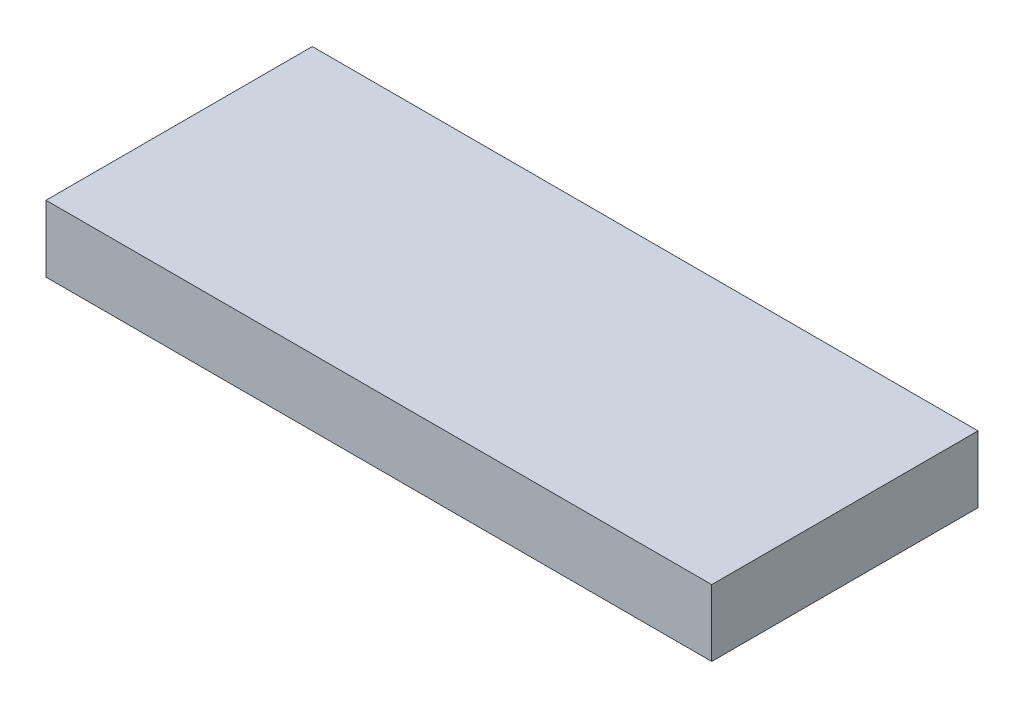
ISO-10303-21;
HEADER;
FILE_DESCRIPTION(('STEP AP214'),'2;1');
FILE_NAME('part.step','',(''),(''),'','','');
FILE_SCHEMA(('AUTOMOTIVE_DESIGN { 1 0 10303 214 1 1 1 1 }'));
ENDSEC;
DATA;
#1=APPLICATION_CONTEXT('core data for automotive mechanical design processes');
#2=APPLICATION_PROTOCOL_DEFINITION('international standard','automotive_design',2000,#1);
#3=PRODUCT_CONTEXT('',#1,'mechanical');
#4=PRODUCT('Part','Part','',(#3));
#5=PRODUCT_RELATED_PRODUCT_CATEGORY('part','',(#4));
#6=PRODUCT_DEFINITION_FORMATION('','',#4);
#7=PRODUCT_DEFINITION_CONTEXT('part definition',#1,'design');
#8=PRODUCT_DEFINITION('design','',#6,#7);
#9=PRODUCT_DEFINITION_SHAPE('','',#8);
#10=(LENGTH_UNIT() NAMED_UNIT(*) SI_UNIT(.MILLI.,.METRE.));
#11=(NAMED_UNIT(*) PLANE_ANGLE_UNIT() SI_UNIT($,.RADIAN.));
#12=(NAMED_UNIT(*) SI_UNIT($,.STERADIAN.) SOLID_ANGLE_UNIT());
#13=UNCERTAINTY_MEASURE_WITH_UNIT(LENGTH_MEASURE(1.E-05),#10,'distance_accuracy_value','');
#14=(GEOMETRIC_REPRESENTATION_CONTEXT(3) GLOBAL_UNCERTAINTY_ASSIGNED_CONTEXT((#13)) GLOBAL_UNIT_ASSIGNED_CONTEXT((#10,
#11,#12)) REPRESENTATION_CONTEXT('',''));
#15=CARTESIAN_POINT('',(0.,0.,0.));
#16=DIRECTION('',(0.,0.,1.));
#17=DIRECTION('',(1.,0.,0.));
#18=AXIS2_PLACEMENT_3D('',#15,#16,#17);
#19=CARTESIAN_POINT('',(0.,6.35,0.));
#20=DIRECTION('',(1.,0.,0.));
#21=DIRECTION('',(0.,0.,-1.));
#22=AXIS2_PLACEMENT_3D('',#19,#20,#21);
#23=PLANE('',#22);
#24=DIRECTION('',(0.,0.,1.));
#25=VECTOR('',#24,1.);
#26=CARTESIAN_POINT('',(0.,0.,0.));
#27=LINE('',#26,#25);
#28=CARTESIAN_POINT('',(0.,0.,0.));
#29=VERTEX_POINT('',#28);
#30=CARTESIAN_POINT('',(0.,0.,25.4));
#31=VERTEX_POINT('',#30);
#32=EDGE_CURVE('E97',#29,#31,#27,.T.);
#33=ORIENTED_EDGE('',*,*,#32,.T.);
#34=DIRECTION('',(0.,-1.,0.));
#35=VECTOR('',#34,1.);
#36=CARTESIAN_POINT('',(0.,6.35,25.4));
#37=LINE('',#36,#35);
#38=CARTESIAN_POINT('',(0.,6.35,25.4));
#39=VERTEX_POINT('',#38);
#40=EDGE_CURVE('E11',#39,#31,#37,.T.);
#41=ORIENTED_EDGE('',*,*,#40,.F.);
#42=DIRECTION('',(0.,0.,1.));
#43=VECTOR('',#42,1.);
#44=CARTESIAN_POINT('',(0.,6.35,0.));
#45=LINE('',#44,#43);
#46=CARTESIAN_POINT('',(0.,6.35,0.));
#47=VERTEX_POINT('',#46);
#48=EDGE_CURVE('E85',#47,#39,#45,.T.);
#49=ORIENTED_EDGE('',*,*,#48,.F.);
#50=DIRECTION('',(0.,-1.,0.));
#51=VECTOR('',#50,1.);
#52=CARTESIAN_POINT('',(0.,6.35,0.));
#53=LINE('',#52,#51);
#54=EDGE_CURVE('E93',#47,#29,#53,.T.);
#55=ORIENTED_EDGE('',*,*,#54,.T.);
#56=EDGE_LOOP('',(#33,#41,#49,#55));
#57=FACE_BOUND('',#56,.T.);
#58=ADVANCED_FACE('F34',(#57),#23,.F.);
#59=CARTESIAN_POINT('',(0.,6.35,25.4));
#60=DIRECTION('',(0.,0.,-1.));
#61=DIRECTION('',(-1.,0.,0.));
#62=AXIS2_PLACEMENT_3D('',#59,#60,#61);
#63=PLANE('',#62);
#64=DIRECTION('',(1.,0.,0.));
#65=VECTOR('',#64,1.);
#66=CARTESIAN_POINT('',(0.,0.,25.4));
#67=LINE('',#66,#65);
#68=CARTESIAN_POINT('',(63.5,0.,25.4));
#69=VERTEX_POINT('',#68);
#70=EDGE_CURVE('E89',#31,#69,#67,.T.);
#71=ORIENTED_EDGE('',*,*,#70,.T.);
#72=DIRECTION('',(0.,-1.,0.));
#73=VECTOR('',#72,1.);
#74=CARTESIAN_POINT('',(63.5,6.35,25.4));
#75=LINE('',#74,#73);
#76=CARTESIAN_POINT('',(63.5,6.35,25.4));
#77=VERTEX_POINT('',#76);
#78=EDGE_CURVE('E42',#77,#69,#75,.T.);
#79=ORIENTED_EDGE('',*,*,#78,.F.);
#80=DIRECTION('',(1.,0.,0.));
#81=VECTOR('',#80,1.);
#82=CARTESIAN_POINT('',(0.,6.35,25.4));
#83=LINE('',#82,#81);
#84=EDGE_CURVE('E80',#39,#77,#83,.T.);
#85=ORIENTED_EDGE('',*,*,#84,.F.);
#86=ORIENTED_EDGE('',*,*,#40,.T.);
#87=EDGE_LOOP('',(#71,#79,#85,#86));
#88=FACE_BOUND('',#87,.T.);
#89=ADVANCED_FACE('F88',(#88),#63,.F.);
#90=CARTESIAN_POINT('',(63.5,6.35,0.));
#91=DIRECTION('',(-1.,0.,0.));
#92=DIRECTION('',(0.,0.,1.));
#93=AXIS2_PLACEMENT_3D('',#90,#91,#92);
#94=PLANE('',#93);
#95=DIRECTION('',(0.,0.,-1.));
#96=VECTOR('',#95,1.);
#97=CARTESIAN_POINT('',(63.5,0.,0.));
#98=LINE('',#97,#96);
#99=CARTESIAN_POINT('',(63.5,0.,0.));
#100=VERTEX_POINT('',#99);
#101=EDGE_CURVE('E67',#69,#100,#98,.T.);
#102=ORIENTED_EDGE('',*,*,#101,.T.);
#103=DIRECTION('',(0.,-1.,0.));
#104=VECTOR('',#103,1.);
#105=CARTESIAN_POINT('',(63.5,6.35,0.));
#106=LINE('',#105,#104);
#107=CARTESIAN_POINT('',(63.5,6.35,0.));
#108=VERTEX_POINT('',#107);
#109=EDGE_CURVE('E90',#108,#100,#106,.T.);
#110=ORIENTED_EDGE('',*,*,#109,.F.);
#111=DIRECTION('',(0.,0.,-1.));
#112=VECTOR('',#111,1.);
#113=CARTESIAN_POINT('',(63.5,6.35,0.));
#114=LINE('',#113,#112);
#115=EDGE_CURVE('E83',#77,#108,#114,.T.);
#116=ORIENTED_EDGE('',*,*,#115,.F.);
#117=ORIENTED_EDGE('',*,*,#78,.T.);
#118=EDGE_LOOP('',(#102,#110,#116,#117));
#119=FACE_BOUND('',#118,.T.);
#120=ADVANCED_FACE('F91',(#119),#94,.F.);
#121=CARTESIAN_POINT('',(0.,6.35,0.));
#122=DIRECTION('',(0.,0.,1.));
#123=DIRECTION('',(1.,0.,0.));
#124=AXIS2_PLACEMENT_3D('',#121,#122,#123);
#125=PLANE('',#124);
#126=DIRECTION('',(-1.,0.,0.));
#127=VECTOR('',#126,1.);
#128=CARTESIAN_POINT('',(0.,0.,0.));
#129=LINE('',#128,#127);
#130=EDGE_CURVE('E73',#100,#29,#129,.T.);
#131=ORIENTED_EDGE('',*,*,#130,.T.);
#132=ORIENTED_EDGE('',*,*,#54,.F.);
#133=DIRECTION('',(-1.,0.,0.));
#134=VECTOR('',#133,1.);
#135=CARTESIAN_POINT('',(0.,6.35,0.));
#136=LINE('',#135,#134);
#137=EDGE_CURVE('E50',#108,#47,#136,.T.);
#138=ORIENTED_EDGE('',*,*,#137,.F.);
#139=ORIENTED_EDGE('',*,*,#109,.T.);
#140=EDGE_LOOP('',(#131,#132,#138,#139));
#141=FACE_BOUND('',#140,.T.);
#142=ADVANCED_FACE('F104',(#141),#125,.F.);
#143=CARTESIAN_POINT('',(0.,6.35,0.));
#144=DIRECTION('',(0.,1.,0.));
#145=DIRECTION('',(0.,0.,1.));
#146=AXIS2_PLACEMENT_3D('',#143,#144,#145);
#147=PLANE('',#146);
#148=ORIENTED_EDGE('',*,*,#48,.T.);
#149=ORIENTED_EDGE('',*,*,#84,.T.);
#150=ORIENTED_EDGE('',*,*,#115,.T.);
#151=ORIENTED_EDGE('',*,*,#137,.T.);
#152=EDGE_LOOP('',(#148,#149,#150,#151));
#153=FACE_BOUND('',#152,.T.);
#154=ADVANCED_FACE('F81',(#153),#147,.T.);
#155=CARTESIAN_POINT('',(0.,0.,0.));
#156=DIRECTION('',(0.,1.,0.));
#157=DIRECTION('',(0.,0.,1.));
#158=AXIS2_PLACEMENT_3D('',#155,#156,#157);
#159=PLANE('',#158);
#160=ORIENTED_EDGE('',*,*,#32,.F.);
#161=ORIENTED_EDGE('',*,*,#130,.F.);
#162=ORIENTED_EDGE('',*,*,#101,.F.);
#163=ORIENTED_EDGE('',*,*,#70,.F.);
#164=EDGE_LOOP('',(#160,#161,#162,#163));
#165=FACE_BOUND('',#164,.T.);
#166=ADVANCED_FACE('F107',(#165),#159,.F.);
#167=CLOSED_SHELL('',(#58,#89,#120,#142,#154,#166));
#168=MANIFOLD_SOLID_BREP('B2',#167);
#169=ADVANCED_BREP_SHAPE_REPRESENTATION('',(#18,#168),#14);
#170=SHAPE_DEFINITION_REPRESENTATION(#9,#169);
ENDSEC;
END-ISO-10303-21;
